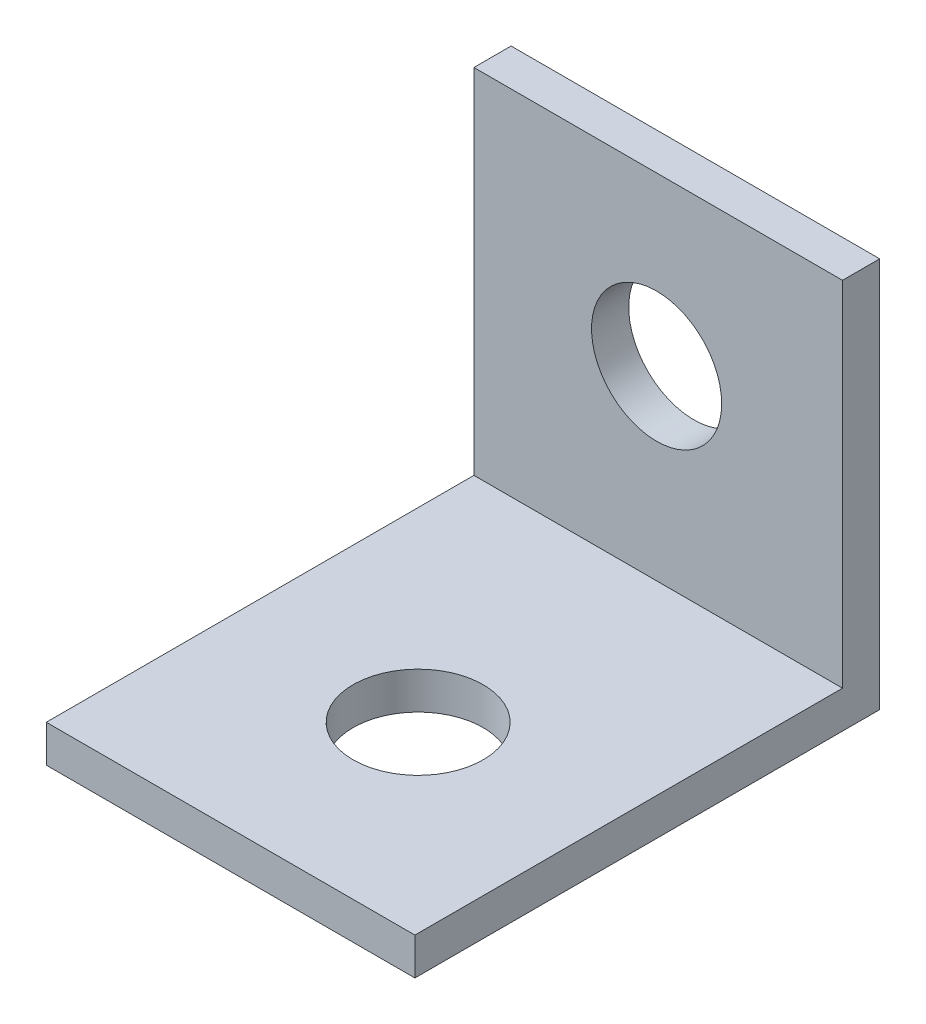
ISO-10303-21;
HEADER;
FILE_DESCRIPTION(('STEP AP214'),'2;1');
FILE_NAME('part.step','',(''),(''),'','','');
FILE_SCHEMA(('AUTOMOTIVE_DESIGN { 1 0 10303 214 1 1 1 1 }'));
ENDSEC;
DATA;
#1=APPLICATION_CONTEXT('core data for automotive mechanical design processes');
#2=APPLICATION_PROTOCOL_DEFINITION('international standard','automotive_design',2000,#1);
#3=PRODUCT_CONTEXT('',#1,'mechanical');
#4=PRODUCT('Part','Part','',(#3));
#5=PRODUCT_RELATED_PRODUCT_CATEGORY('part','',(#4));
#6=PRODUCT_DEFINITION_FORMATION('','',#4);
#7=PRODUCT_DEFINITION_CONTEXT('part definition',#1,'design');
#8=PRODUCT_DEFINITION('design','',#6,#7);
#9=PRODUCT_DEFINITION_SHAPE('','',#8);
#10=(LENGTH_UNIT() NAMED_UNIT(*) SI_UNIT(.MILLI.,.METRE.));
#11=(NAMED_UNIT(*) PLANE_ANGLE_UNIT() SI_UNIT($,.RADIAN.));
#12=(NAMED_UNIT(*) SI_UNIT($,.STERADIAN.) SOLID_ANGLE_UNIT());
#13=UNCERTAINTY_MEASURE_WITH_UNIT(LENGTH_MEASURE(1.E-05),#10,'distance_accuracy_value','');
#14=(GEOMETRIC_REPRESENTATION_CONTEXT(3) GLOBAL_UNCERTAINTY_ASSIGNED_CONTEXT((#13)) GLOBAL_UNIT_ASSIGNED_CONTEXT((#10,
#11,#12)) REPRESENTATION_CONTEXT('',''));
#15=CARTESIAN_POINT('',(0.,0.,0.));
#16=DIRECTION('',(0.,0.,1.));
#17=DIRECTION('',(1.,0.,0.));
#18=AXIS2_PLACEMENT_3D('',#15,#16,#17);
#19=CARTESIAN_POINT('',(0.,1.,0.));
#20=DIRECTION('',(-1.,0.,0.));
#21=DIRECTION('',(0.,0.,1.));
#22=AXIS2_PLACEMENT_3D('',#19,#20,#21);
#23=PLANE('',#22);
#24=DIRECTION('',(0.,0.,-1.));
#25=VECTOR('',#24,1.);
#26=CARTESIAN_POINT('',(0.,0.,0.));
#27=LINE('',#26,#25);
#28=CARTESIAN_POINT('',(0.,0.,0.));
#29=VERTEX_POINT('',#28);
#30=CARTESIAN_POINT('',(0.,0.,-12.5));
#31=VERTEX_POINT('',#30);
#32=EDGE_CURVE('E102',#29,#31,#27,.T.);
#33=ORIENTED_EDGE('',*,*,#32,.F.);
#34=DIRECTION('',(0.,-1.,0.));
#35=VECTOR('',#34,1.);
#36=CARTESIAN_POINT('',(0.,1.,0.));
#37=LINE('',#36,#35);
#38=CARTESIAN_POINT('',(0.,1.,0.));
#39=VERTEX_POINT('',#38);
#40=EDGE_CURVE('E11',#39,#29,#37,.T.);
#41=ORIENTED_EDGE('',*,*,#40,.F.);
#42=DIRECTION('',(0.,0.,-1.));
#43=VECTOR('',#42,1.);
#44=CARTESIAN_POINT('',(0.,1.,0.));
#45=LINE('',#44,#43);
#46=CARTESIAN_POINT('',(0.,1.,-11.5));
#47=VERTEX_POINT('',#46);
#48=EDGE_CURVE('E79',#39,#47,#45,.T.);
#49=ORIENTED_EDGE('',*,*,#48,.T.);
#50=DIRECTION('',(0.,-1.,0.));
#51=VECTOR('',#50,1.);
#52=CARTESIAN_POINT('',(0.,10.5,-11.5));
#53=LINE('',#52,#51);
#54=CARTESIAN_POINT('',(0.,10.5,-11.5));
#55=VERTEX_POINT('',#54);
#56=EDGE_CURVE('E90',#55,#47,#53,.T.);
#57=ORIENTED_EDGE('',*,*,#56,.F.);
#58=DIRECTION('',(0.,0.,-1.));
#59=VECTOR('',#58,1.);
#60=CARTESIAN_POINT('',(0.,10.5,0.));
#61=LINE('',#60,#59);
#62=CARTESIAN_POINT('',(0.,10.5,-12.5));
#63=VERTEX_POINT('',#62);
#64=EDGE_CURVE('E130',#55,#63,#61,.T.);
#65=ORIENTED_EDGE('',*,*,#64,.T.);
#66=DIRECTION('',(0.,-1.,0.));
#67=VECTOR('',#66,1.);
#68=CARTESIAN_POINT('',(0.,10.5,-12.5));
#69=LINE('',#68,#67);
#70=EDGE_CURVE('E128',#63,#31,#69,.T.);
#71=ORIENTED_EDGE('',*,*,#70,.T.);
#72=EDGE_LOOP('',(#33,#41,#49,#57,#65,#71));
#73=FACE_BOUND('',#72,.T.);
#74=ADVANCED_FACE('F34',(#73),#23,.T.);
#75=CARTESIAN_POINT('',(0.,1.,0.));
#76=DIRECTION('',(0.,0.,-1.));
#77=DIRECTION('',(-1.,0.,0.));
#78=AXIS2_PLACEMENT_3D('',#75,#76,#77);
#79=PLANE('',#78);
#80=DIRECTION('',(1.,0.,0.));
#81=VECTOR('',#80,1.);
#82=CARTESIAN_POINT('',(0.,0.,0.));
#83=LINE('',#82,#81);
#84=CARTESIAN_POINT('',(9.91326949002905,0.,0.));
#85=VERTEX_POINT('',#84);
#86=EDGE_CURVE('E115',#29,#85,#83,.T.);
#87=ORIENTED_EDGE('',*,*,#86,.T.);
#88=DIRECTION('',(0.,-1.,0.));
#89=VECTOR('',#88,1.);
#90=CARTESIAN_POINT('',(9.91326949002905,1.,0.));
#91=LINE('',#90,#89);
#92=CARTESIAN_POINT('',(9.91326949002905,1.,0.));
#93=VERTEX_POINT('',#92);
#94=EDGE_CURVE('E43',#93,#85,#91,.T.);
#95=ORIENTED_EDGE('',*,*,#94,.F.);
#96=DIRECTION('',(1.,0.,0.));
#97=VECTOR('',#96,1.);
#98=CARTESIAN_POINT('',(0.,1.,0.));
#99=LINE('',#98,#97);
#100=EDGE_CURVE('E92',#39,#93,#99,.T.);
#101=ORIENTED_EDGE('',*,*,#100,.F.);
#102=ORIENTED_EDGE('',*,*,#40,.T.);
#103=EDGE_LOOP('',(#87,#95,#101,#102));
#104=FACE_BOUND('',#103,.T.);
#105=ADVANCED_FACE('F123',(#104),#79,.F.);
#106=CARTESIAN_POINT('',(5.,1.,-5.));
#107=DIRECTION('',(0.,-1.,0.));
#108=DIRECTION('',(0.,0.,-1.));
#109=AXIS2_PLACEMENT_3D('',#106,#107,#108);
#110=CYLINDRICAL_SURFACE('',#109,1.75);
#111=CARTESIAN_POINT('',(5.,1.,-5.));
#112=DIRECTION('',(0.,1.,0.));
#113=DIRECTION('',(0.,0.,1.));
#114=AXIS2_PLACEMENT_3D('',#111,#112,#113);
#115=CIRCLE('',#114,1.75);
#116=CARTESIAN_POINT('',(5.,1.,-3.25));
#117=VERTEX_POINT('',#116);
#118=EDGE_CURVE('E83',#117,#117,#115,.T.);
#119=ORIENTED_EDGE('',*,*,#118,.T.);
#120=EDGE_LOOP('',(#119));
#121=FACE_BOUND('',#120,.T.);
#122=CARTESIAN_POINT('',(5.,0.,-5.));
#123=DIRECTION('',(0.,1.,0.));
#124=DIRECTION('',(0.,0.,1.));
#125=AXIS2_PLACEMENT_3D('',#122,#123,#124);
#126=CIRCLE('',#125,1.75);
#127=CARTESIAN_POINT('',(5.,0.,-3.25));
#128=VERTEX_POINT('',#127);
#129=EDGE_CURVE('E98',#128,#128,#126,.T.);
#130=ORIENTED_EDGE('',*,*,#129,.F.);
#131=EDGE_LOOP('',(#130));
#132=FACE_BOUND('',#131,.T.);
#133=ADVANCED_FACE('F36',(#121,#132),#110,.F.);
#134=CARTESIAN_POINT('',(9.91326949002905,1.,0.));
#135=DIRECTION('',(-1.,0.,0.));
#136=DIRECTION('',(0.,0.,1.));
#137=AXIS2_PLACEMENT_3D('',#134,#135,#136);
#138=PLANE('',#137);
#139=DIRECTION('',(0.,0.,-1.));
#140=VECTOR('',#139,1.);
#141=CARTESIAN_POINT('',(9.91326949002905,0.,0.));
#142=LINE('',#141,#140);
#143=CARTESIAN_POINT('',(9.91326949002905,0.,-12.5));
#144=VERTEX_POINT('',#143);
#145=EDGE_CURVE('E109',#85,#144,#142,.T.);
#146=ORIENTED_EDGE('',*,*,#145,.T.);
#147=DIRECTION('',(0.,-1.,0.));
#148=VECTOR('',#147,1.);
#149=CARTESIAN_POINT('',(9.91326949002905,10.5,-12.5));
#150=LINE('',#149,#148);
#151=CARTESIAN_POINT('',(9.91326949002905,10.5,-12.5));
#152=VERTEX_POINT('',#151);
#153=EDGE_CURVE('E104',#152,#144,#150,.T.);
#154=ORIENTED_EDGE('',*,*,#153,.F.);
#155=DIRECTION('',(0.,0.,-1.));
#156=VECTOR('',#155,1.);
#157=CARTESIAN_POINT('',(9.91326949002905,10.5,0.));
#158=LINE('',#157,#156);
#159=CARTESIAN_POINT('',(9.91326949002905,10.5,-11.5));
#160=VERTEX_POINT('',#159);
#161=EDGE_CURVE('E146',#160,#152,#158,.T.);
#162=ORIENTED_EDGE('',*,*,#161,.F.);
#163=DIRECTION('',(0.,-1.,0.));
#164=VECTOR('',#163,1.);
#165=CARTESIAN_POINT('',(9.91326949002905,10.5,-11.5));
#166=LINE('',#165,#164);
#167=CARTESIAN_POINT('',(9.91326949002905,1.,-11.5));
#168=VERTEX_POINT('',#167);
#169=EDGE_CURVE('E99',#160,#168,#166,.T.);
#170=ORIENTED_EDGE('',*,*,#169,.T.);
#171=DIRECTION('',(0.,0.,-1.));
#172=VECTOR('',#171,1.);
#173=CARTESIAN_POINT('',(9.91326949002905,1.,0.));
#174=LINE('',#173,#172);
#175=EDGE_CURVE('E51',#93,#168,#174,.T.);
#176=ORIENTED_EDGE('',*,*,#175,.F.);
#177=ORIENTED_EDGE('',*,*,#94,.T.);
#178=EDGE_LOOP('',(#146,#154,#162,#170,#176,#177));
#179=FACE_BOUND('',#178,.T.);
#180=ADVANCED_FACE('F119',(#179),#138,.F.);
#181=CARTESIAN_POINT('',(0.,1.,0.));
#182=DIRECTION('',(0.,1.,0.));
#183=DIRECTION('',(0.,0.,1.));
#184=AXIS2_PLACEMENT_3D('',#181,#182,#183);
#185=PLANE('',#184);
#186=ORIENTED_EDGE('',*,*,#118,.F.);
#187=EDGE_LOOP('',(#186));
#188=FACE_BOUND('',#187,.T.);
#189=DIRECTION('',(1.,0.,0.));
#190=VECTOR('',#189,1.);
#191=CARTESIAN_POINT('',(0.,1.,-11.5));
#192=LINE('',#191,#190);
#193=EDGE_CURVE('E76',#47,#168,#192,.T.);
#194=ORIENTED_EDGE('',*,*,#193,.F.);
#195=ORIENTED_EDGE('',*,*,#48,.F.);
#196=ORIENTED_EDGE('',*,*,#100,.T.);
#197=ORIENTED_EDGE('',*,*,#175,.T.);
#198=EDGE_LOOP('',(#194,#195,#196,#197));
#199=FACE_BOUND('',#198,.T.);
#200=ADVANCED_FACE('F78',(#188,#199),#185,.T.);
#201=CARTESIAN_POINT('',(0.,0.,0.));
#202=DIRECTION('',(0.,1.,0.));
#203=DIRECTION('',(0.,0.,1.));
#204=AXIS2_PLACEMENT_3D('',#201,#202,#203);
#205=PLANE('',#204);
#206=ORIENTED_EDGE('',*,*,#129,.T.);
#207=EDGE_LOOP('',(#206));
#208=FACE_BOUND('',#207,.T.);
#209=ORIENTED_EDGE('',*,*,#32,.T.);
#210=DIRECTION('',(1.,0.,0.));
#211=VECTOR('',#210,1.);
#212=CARTESIAN_POINT('',(0.,0.,-12.5));
#213=LINE('',#212,#211);
#214=EDGE_CURVE('E136',#31,#144,#213,.T.);
#215=ORIENTED_EDGE('',*,*,#214,.T.);
#216=ORIENTED_EDGE('',*,*,#145,.F.);
#217=ORIENTED_EDGE('',*,*,#86,.F.);
#218=EDGE_LOOP('',(#209,#215,#216,#217));
#219=FACE_BOUND('',#218,.T.);
#220=ADVANCED_FACE('F125',(#208,#219),#205,.F.);
#221=CARTESIAN_POINT('',(0.,10.5,-11.5));
#222=DIRECTION('',(0.,0.,-1.));
#223=DIRECTION('',(-1.,0.,0.));
#224=AXIS2_PLACEMENT_3D('',#221,#222,#223);
#225=PLANE('',#224);
#226=CARTESIAN_POINT('',(4.91326949002905,6.,-11.5));
#227=DIRECTION('',(0.,0.,1.));
#228=DIRECTION('',(1.,0.,0.));
#229=AXIS2_PLACEMENT_3D('',#226,#227,#228);
#230=CIRCLE('',#229,1.75);
#231=CARTESIAN_POINT('',(6.66326949002905,6.,-11.5));
#232=VERTEX_POINT('',#231);
#233=EDGE_CURVE('E142',#232,#232,#230,.T.);
#234=ORIENTED_EDGE('',*,*,#233,.F.);
#235=EDGE_LOOP('',(#234));
#236=FACE_BOUND('',#235,.T.);
#237=ORIENTED_EDGE('',*,*,#56,.T.);
#238=ORIENTED_EDGE('',*,*,#193,.T.);
#239=ORIENTED_EDGE('',*,*,#169,.F.);
#240=DIRECTION('',(1.,0.,0.));
#241=VECTOR('',#240,1.);
#242=CARTESIAN_POINT('',(0.,10.5,-11.5));
#243=LINE('',#242,#241);
#244=EDGE_CURVE('E96',#55,#160,#243,.T.);
#245=ORIENTED_EDGE('',*,*,#244,.F.);
#246=EDGE_LOOP('',(#237,#238,#239,#245));
#247=FACE_BOUND('',#246,.T.);
#248=ADVANCED_FACE('F94',(#236,#247),#225,.F.);
#249=CARTESIAN_POINT('',(0.,10.5,-12.5));
#250=DIRECTION('',(0.,0.,-1.));
#251=DIRECTION('',(-1.,0.,0.));
#252=AXIS2_PLACEMENT_3D('',#249,#250,#251);
#253=PLANE('',#252);
#254=CARTESIAN_POINT('',(4.91326949002905,6.,-12.5));
#255=DIRECTION('',(0.,0.,1.));
#256=DIRECTION('',(1.,0.,0.));
#257=AXIS2_PLACEMENT_3D('',#254,#255,#256);
#258=CIRCLE('',#257,1.75);
#259=CARTESIAN_POINT('',(6.66326949002905,6.,-12.5));
#260=VERTEX_POINT('',#259);
#261=EDGE_CURVE('E138',#260,#260,#258,.T.);
#262=ORIENTED_EDGE('',*,*,#261,.T.);
#263=EDGE_LOOP('',(#262));
#264=FACE_BOUND('',#263,.T.);
#265=ORIENTED_EDGE('',*,*,#214,.F.);
#266=ORIENTED_EDGE('',*,*,#70,.F.);
#267=DIRECTION('',(1.,0.,0.));
#268=VECTOR('',#267,1.);
#269=CARTESIAN_POINT('',(0.,10.5,-12.5));
#270=LINE('',#269,#268);
#271=EDGE_CURVE('E134',#63,#152,#270,.T.);
#272=ORIENTED_EDGE('',*,*,#271,.T.);
#273=ORIENTED_EDGE('',*,*,#153,.T.);
#274=EDGE_LOOP('',(#265,#266,#272,#273));
#275=FACE_BOUND('',#274,.T.);
#276=ADVANCED_FACE('F137',(#264,#275),#253,.T.);
#277=CARTESIAN_POINT('',(0.,10.5,0.));
#278=DIRECTION('',(0.,1.,0.));
#279=DIRECTION('',(0.,0.,1.));
#280=AXIS2_PLACEMENT_3D('',#277,#278,#279);
#281=PLANE('',#280);
#282=ORIENTED_EDGE('',*,*,#64,.F.);
#283=ORIENTED_EDGE('',*,*,#244,.T.);
#284=ORIENTED_EDGE('',*,*,#161,.T.);
#285=ORIENTED_EDGE('',*,*,#271,.F.);
#286=EDGE_LOOP('',(#282,#283,#284,#285));
#287=FACE_BOUND('',#286,.T.);
#288=ADVANCED_FACE('F161',(#287),#281,.T.);
#289=CARTESIAN_POINT('',(4.91326949002905,6.,-12.5));
#290=DIRECTION('',(0.,0.,1.));
#291=DIRECTION('',(1.,0.,0.));
#292=AXIS2_PLACEMENT_3D('',#289,#290,#291);
#293=CYLINDRICAL_SURFACE('',#292,1.75);
#294=ORIENTED_EDGE('',*,*,#261,.F.);
#295=EDGE_LOOP('',(#294));
#296=FACE_BOUND('',#295,.T.);
#297=ORIENTED_EDGE('',*,*,#233,.T.);
#298=EDGE_LOOP('',(#297));
#299=FACE_BOUND('',#298,.T.);
#300=ADVANCED_FACE('F153',(#296,#299),#293,.F.);
#301=CLOSED_SHELL('',(#74,#105,#133,#180,#200,#220,#248,#276,#288,#300));
#302=MANIFOLD_SOLID_BREP('B2',#301);
#303=ADVANCED_BREP_SHAPE_REPRESENTATION('',(#18,#302),#14);
#304=SHAPE_DEFINITION_REPRESENTATION(#9,#303);
ENDSEC;
END-ISO-10303-21;
